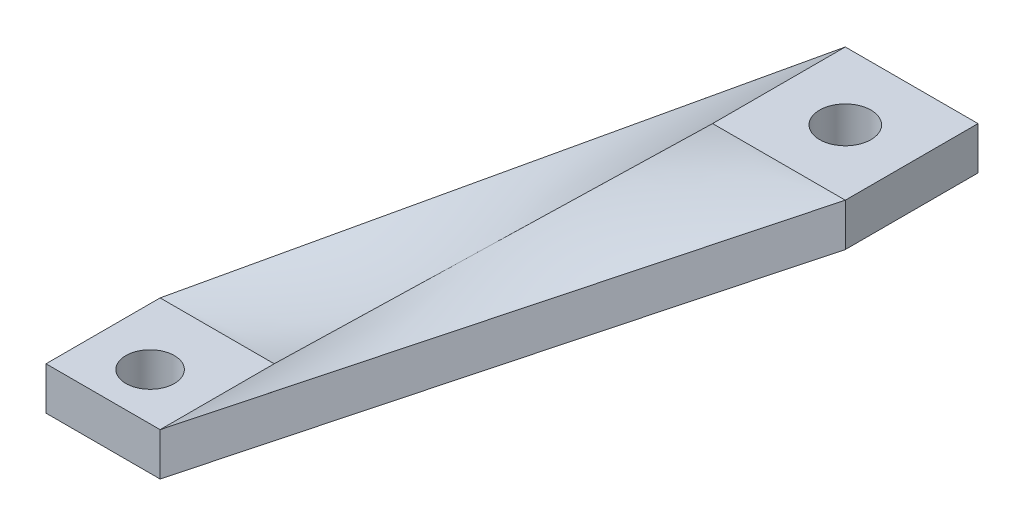
ISO-10303-21;
HEADER;
FILE_DESCRIPTION(('STEP AP214'),'2;1');
FILE_NAME('part.step','',(''),(''),'','','');
FILE_SCHEMA(('AUTOMOTIVE_DESIGN { 1 0 10303 214 1 1 1 1 }'));
ENDSEC;
DATA;
#1=APPLICATION_CONTEXT('core data for automotive mechanical design processes');
#2=APPLICATION_PROTOCOL_DEFINITION('international standard','automotive_design',2000,#1);
#3=PRODUCT_CONTEXT('',#1,'mechanical');
#4=PRODUCT('Part','Part','',(#3));
#5=PRODUCT_RELATED_PRODUCT_CATEGORY('part','',(#4));
#6=PRODUCT_DEFINITION_FORMATION('','',#4);
#7=PRODUCT_DEFINITION_CONTEXT('part definition',#1,'design');
#8=PRODUCT_DEFINITION('design','',#6,#7);
#9=PRODUCT_DEFINITION_SHAPE('','',#8);
#10=(LENGTH_UNIT() NAMED_UNIT(*) SI_UNIT(.MILLI.,.METRE.));
#11=(NAMED_UNIT(*) PLANE_ANGLE_UNIT() SI_UNIT($,.RADIAN.));
#12=(NAMED_UNIT(*) SI_UNIT($,.STERADIAN.) SOLID_ANGLE_UNIT());
#13=UNCERTAINTY_MEASURE_WITH_UNIT(LENGTH_MEASURE(1.E-05),#10,'distance_accuracy_value','');
#14=(GEOMETRIC_REPRESENTATION_CONTEXT(3) GLOBAL_UNCERTAINTY_ASSIGNED_CONTEXT((#13)) GLOBAL_UNIT_ASSIGNED_CONTEXT((#10,
#11,#12)) REPRESENTATION_CONTEXT('',''));
#15=CARTESIAN_POINT('',(0.,0.,0.));
#16=DIRECTION('',(0.,0.,1.));
#17=DIRECTION('',(1.,0.,0.));
#18=AXIS2_PLACEMENT_3D('',#15,#16,#17);
#19=CARTESIAN_POINT('',(0.,8.7442453895232,86.0034095229777));
#20=DIRECTION('',(0.,0.,1.));
#21=DIRECTION('',(0.,1.,0.));
#22=AXIS2_PLACEMENT_3D('',#19,#20,#21);
#23=PLANE('',#22);
#24=DIRECTION('',(1.,0.,0.));
#25=VECTOR('',#24,1.);
#26=CARTESIAN_POINT('',(0.,5.7442453895232,86.0034095229777));
#27=LINE('',#26,#25);
#28=CARTESIAN_POINT('',(199.460010772794,5.7442453895231,86.0034095229777));
#29=VERTEX_POINT('',#28);
#30=CARTESIAN_POINT('',(207.460010772794,5.7442453895231,86.0034095229777));
#31=VERTEX_POINT('',#30);
#32=EDGE_CURVE('E228',#29,#31,#27,.T.);
#33=ORIENTED_EDGE('',*,*,#32,.T.);
#34=DIRECTION('',(0.,-1.,0.));
#35=VECTOR('',#34,1.);
#36=CARTESIAN_POINT('',(207.460010772794,8.7442453895231,86.0034095229777));
#37=LINE('',#36,#35);
#38=CARTESIAN_POINT('',(207.460010772794,8.7442453895231,86.0034095229777));
#39=VERTEX_POINT('',#38);
#40=EDGE_CURVE('E250',#39,#31,#37,.T.);
#41=ORIENTED_EDGE('',*,*,#40,.F.);
#42=DIRECTION('',(1.,0.,0.));
#43=VECTOR('',#42,1.);
#44=CARTESIAN_POINT('',(0.,8.7442453895232,86.0034095229777));
#45=LINE('',#44,#43);
#46=CARTESIAN_POINT('',(199.460010772794,8.74424538952311,86.0034095229777));
#47=VERTEX_POINT('',#46);
#48=EDGE_CURVE('E240',#47,#39,#45,.T.);
#49=ORIENTED_EDGE('',*,*,#48,.F.);
#50=DIRECTION('',(0.,-1.,0.));
#51=VECTOR('',#50,1.);
#52=CARTESIAN_POINT('',(199.460010772794,8.74424538952311,86.0034095229777));
#53=LINE('',#52,#51);
#54=EDGE_CURVE('E12',#47,#29,#53,.T.);
#55=ORIENTED_EDGE('',*,*,#54,.T.);
#56=EDGE_LOOP('',(#33,#41,#49,#55));
#57=FACE_BOUND('',#56,.T.);
#58=ADVANCED_FACE('F157',(#57),#23,.T.);
#59=CARTESIAN_POINT('',(199.460010497585,8.74424538952311,-6.38269011452453E-07));
#60=DIRECTION('',(1.,0.,-3.19998484878669E-09));
#61=DIRECTION('',(3.19998484878669E-09,0.,1.));
#62=AXIS2_PLACEMENT_3D('',#59,#60,#61);
#63=PLANE('',#62);
#64=DIRECTION('',(-3.19998484878669E-09,0.,-1.));
#65=VECTOR('',#64,1.);
#66=CARTESIAN_POINT('',(199.460010497585,5.7442453895231,-6.38269011531105E-07));
#67=LINE('',#66,#65);
#68=CARTESIAN_POINT('',(199.460010747194,5.7442453895231,78.0034095229777));
#69=VERTEX_POINT('',#68);
#70=EDGE_CURVE('E257',#29,#69,#67,.T.);
#71=ORIENTED_EDGE('',*,*,#70,.F.);
#72=ORIENTED_EDGE('',*,*,#54,.F.);
#73=DIRECTION('',(-3.19998484878669E-09,0.,-1.));
#74=VECTOR('',#73,1.);
#75=CARTESIAN_POINT('',(199.460010497585,8.74424538952311,-6.38269011452453E-07));
#76=LINE('',#75,#74);
#77=CARTESIAN_POINT('',(199.460010747194,8.74424538952311,78.0034095229777));
#78=VERTEX_POINT('',#77);
#79=EDGE_CURVE('E235',#47,#78,#76,.T.);
#80=ORIENTED_EDGE('',*,*,#79,.T.);
#81=DIRECTION('',(0.,-1.,0.));
#82=VECTOR('',#81,1.);
#83=CARTESIAN_POINT('',(199.460010747194,8.74424538952311,78.0034095229777));
#84=LINE('',#83,#82);
#85=EDGE_CURVE('E166',#78,#69,#84,.T.);
#86=ORIENTED_EDGE('',*,*,#85,.T.);
#87=EDGE_LOOP('',(#71,#72,#80,#86));
#88=FACE_BOUND('',#87,.T.);
#89=ADVANCED_FACE('F282',(#88),#63,.F.);
#90=CARTESIAN_POINT('',(203.460010747194,8.7442453895231,82.7034095101777));
#91=DIRECTION('',(0.,-1.,0.));
#92=DIRECTION('',(1.,0.,0.));
#93=AXIS2_PLACEMENT_3D('',#90,#91,#92);
#94=CYLINDRICAL_SURFACE('',#93,1.69999999999999);
#95=CARTESIAN_POINT('',(203.460010747194,8.7442453895231,82.7034095101777));
#96=DIRECTION('',(0.,-1.,0.));
#97=DIRECTION('',(-1.,0.,0.));
#98=AXIS2_PLACEMENT_3D('',#95,#96,#97);
#99=CIRCLE('',#98,1.69999999999999);
#100=CARTESIAN_POINT('',(201.760010747194,8.7442453895231,82.7034095101777));
#101=VERTEX_POINT('',#100);
#102=EDGE_CURVE('E243',#101,#101,#99,.F.);
#103=ORIENTED_EDGE('',*,*,#102,.T.);
#104=EDGE_LOOP('',(#103));
#105=FACE_BOUND('',#104,.T.);
#106=CARTESIAN_POINT('',(203.460010747194,5.7442453895231,82.7034095101777));
#107=DIRECTION('',(0.,-1.,0.));
#108=DIRECTION('',(-1.,0.,0.));
#109=AXIS2_PLACEMENT_3D('',#106,#107,#108);
#110=CIRCLE('',#109,1.69999999999999);
#111=CARTESIAN_POINT('',(201.760010747194,5.7442453895231,82.7034095101777));
#112=VERTEX_POINT('',#111);
#113=EDGE_CURVE('E269',#112,#112,#110,.F.);
#114=ORIENTED_EDGE('',*,*,#113,.F.);
#115=EDGE_LOOP('',(#114));
#116=FACE_BOUND('',#115,.T.);
#117=ADVANCED_FACE('F399',(#105,#116),#94,.F.);
#118=CARTESIAN_POINT('',(0.,8.7442453895232,0.));
#119=DIRECTION('',(0.,1.,0.));
#120=DIRECTION('',(-1.,0.,0.));
#121=AXIS2_PLACEMENT_3D('',#118,#119,#120);
#122=PLANE('',#121);
#123=ORIENTED_EDGE('',*,*,#48,.T.);
#124=DIRECTION('',(3.19998484878669E-09,0.,1.));
#125=VECTOR('',#124,1.);
#126=CARTESIAN_POINT('',(207.460010497585,8.7442453895231,-6.63868890242747E-07));
#127=LINE('',#126,#125);
#128=CARTESIAN_POINT('',(207.460010747194,8.7442453895231,78.0034094973778));
#129=VERTEX_POINT('',#128);
#130=EDGE_CURVE('E222',#129,#39,#127,.T.);
#131=ORIENTED_EDGE('',*,*,#130,.F.);
#132=DIRECTION('',(1.,0.,-3.19998393061293E-09));
#133=VECTOR('',#132,1.);
#134=CARTESIAN_POINT('',(2.49609663369746E-07,8.7442453895232,78.0034101612465));
#135=LINE('',#134,#133);
#136=EDGE_CURVE('E230',#78,#129,#135,.T.);
#137=ORIENTED_EDGE('',*,*,#136,.F.);
#138=ORIENTED_EDGE('',*,*,#79,.F.);
#139=EDGE_LOOP('',(#123,#131,#137,#138));
#140=FACE_BOUND('',#139,.T.);
#141=ORIENTED_EDGE('',*,*,#102,.F.);
#142=EDGE_LOOP('',(#141));
#143=FACE_BOUND('',#142,.T.);
#144=ADVANCED_FACE('F237',(#140,#143),#122,.T.);
#145=CARTESIAN_POINT('',(0.,5.7442453895232,0.));
#146=DIRECTION('',(0.,1.,0.));
#147=DIRECTION('',(-1.,0.,0.));
#148=AXIS2_PLACEMENT_3D('',#145,#146,#147);
#149=PLANE('',#148);
#150=ORIENTED_EDGE('',*,*,#32,.F.);
#151=ORIENTED_EDGE('',*,*,#70,.T.);
#152=DIRECTION('',(1.,0.,-3.19998393061293E-09));
#153=VECTOR('',#152,1.);
#154=CARTESIAN_POINT('',(2.49609661863139E-07,5.7442453895232,78.0034101612465));
#155=LINE('',#154,#153);
#156=CARTESIAN_POINT('',(207.460010747194,5.7442453895231,78.0034094973778));
#157=VERTEX_POINT('',#156);
#158=EDGE_CURVE('E261',#69,#157,#155,.T.);
#159=ORIENTED_EDGE('',*,*,#158,.T.);
#160=DIRECTION('',(3.19998484878669E-09,0.,1.));
#161=VECTOR('',#160,1.);
#162=CARTESIAN_POINT('',(207.460010497585,5.7442453895231,-6.63868890321399E-07));
#163=LINE('',#162,#161);
#164=EDGE_CURVE('E265',#157,#31,#163,.T.);
#165=ORIENTED_EDGE('',*,*,#164,.T.);
#166=EDGE_LOOP('',(#150,#151,#159,#165));
#167=FACE_BOUND('',#166,.T.);
#168=ORIENTED_EDGE('',*,*,#113,.T.);
#169=EDGE_LOOP('',(#168));
#170=FACE_BOUND('',#169,.T.);
#171=ADVANCED_FACE('F287',(#167,#170),#149,.F.);
#172=CARTESIAN_POINT('',(207.460010747194,8.7442453895231,78.0034094973778));
#173=CARTESIAN_POINT('',(232.000000065795,32.4999999999999,71.8034094188298));
#174=CARTESIAN_POINT('',(199.460010747194,8.74424538952311,78.0034095229777));
#175=CARTESIAN_POINT('',(232.000000036021,32.5,62.4989992095847));
#176=B_SPLINE_SURFACE_WITH_KNOTS('',1,1,((#172,#173),(#174,#175)),.UNSPECIFIED.,.F.,.F.,.F.,(2,
2),(2,2),(0.,1.),(0.,1.),.UNSPECIFIED.);
#177=DIRECTION('',(0.706941043969942,0.684349033187841,-0.178607841724701));
#178=VECTOR('',#177,1.);
#179=CARTESIAN_POINT('',(219.730005406495,20.6221226947615,74.9034094581038));
#180=LINE('',#179,#178);
#181=CARTESIAN_POINT('',(232.000000065795,32.4999999999999,71.8034094188298));
#182=VERTEX_POINT('',#181);
#183=EDGE_CURVE('E219',#129,#182,#180,.T.);
#184=DIRECTION('',(-3.19998370716861E-09,0.,-1.));
#185=VECTOR('',#184,1.);
#186=CARTESIAN_POINT('',(232.000000050908,32.4999999999999,67.1512043142073));
#187=LINE('',#186,#185);
#188=CARTESIAN_POINT('',(232.000000036021,32.5,62.4989992095847));
#189=VERTEX_POINT('',#188);
#190=EDGE_CURVE('E307',#182,#189,#187,.T.);
#191=DIRECTION('',(0.753779184548307,0.550294997938539,-0.359155058694032));
#192=VECTOR('',#191,1.);
#193=CARTESIAN_POINT('',(215.730005391608,20.6221226947615,70.2512043662812));
#194=LINE('',#193,#192);
#195=EDGE_CURVE('E173',#78,#189,#194,.T.);
#196=ORIENTED_EDGE('',*,*,#136,.T.);
#197=ORIENTED_EDGE('',*,*,#183,.T.);
#198=ORIENTED_EDGE('',*,*,#190,.T.);
#199=ORIENTED_EDGE('',*,*,#195,.F.);
#200=EDGE_LOOP('',(#196,#197,#198,#199));
#201=FACE_BOUND('',#200,.T.);
#202=ADVANCED_FACE('F231',(#201),#176,.F.);
#203=CARTESIAN_POINT('',(199.460010747194,8.74424538952311,78.0034095229777));
#204=DIRECTION('',(-0.430141114303507,0.,-0.902761663887948));
#205=DIRECTION('',(0.,-1.,0.));
#206=AXIS2_PLACEMENT_3D('',#203,#204,#205);
#207=PLANE('',#206);
#208=ORIENTED_EDGE('',*,*,#85,.F.);
#209=ORIENTED_EDGE('',*,*,#195,.T.);
#210=DIRECTION('',(0.,-1.,0.));
#211=VECTOR('',#210,1.);
#212=CARTESIAN_POINT('',(232.000000036021,31.,62.4989992095847));
#213=LINE('',#212,#211);
#214=CARTESIAN_POINT('',(232.000000036021,29.5,62.4989992095847));
#215=VERTEX_POINT('',#214);
#216=EDGE_CURVE('E302',#189,#215,#213,.T.);
#217=ORIENTED_EDGE('',*,*,#216,.T.);
#218=DIRECTION('',(0.753779184548307,0.550294997938539,-0.359155058694032));
#219=VECTOR('',#218,1.);
#220=CARTESIAN_POINT('',(215.730005391608,17.6221226947615,70.2512043662812));
#221=LINE('',#220,#219);
#222=EDGE_CURVE('E314',#69,#215,#221,.T.);
#223=ORIENTED_EDGE('',*,*,#222,.F.);
#224=EDGE_LOOP('',(#208,#209,#217,#223));
#225=FACE_BOUND('',#224,.T.);
#226=ADVANCED_FACE('F373',(#225),#207,.T.);
#227=CARTESIAN_POINT('',(199.460010747194,5.7442453895231,78.0034095229777));
#228=CARTESIAN_POINT('',(232.000000036021,29.5,62.4989992095847));
#229=CARTESIAN_POINT('',(207.460010747194,5.7442453895231,78.0034094973778));
#230=CARTESIAN_POINT('',(232.000000065795,29.4999999999999,71.8034094188298));
#231=B_SPLINE_SURFACE_WITH_KNOTS('',1,1,((#227,#228),(#229,#230)),.UNSPECIFIED.,.F.,.F.,.F.,(2,
2),(2,2),(0.,1.),(0.,1.),.UNSPECIFIED.);
#232=DIRECTION('',(3.19998370716861E-09,0.,1.));
#233=VECTOR('',#232,1.);
#234=CARTESIAN_POINT('',(232.000000050908,29.5,67.1512043142073));
#235=LINE('',#234,#233);
#236=CARTESIAN_POINT('',(232.000000065795,29.4999999999999,71.8034094188298));
#237=VERTEX_POINT('',#236);
#238=EDGE_CURVE('E298',#215,#237,#235,.T.);
#239=DIRECTION('',(0.706941043969942,0.684349033187841,-0.178607841724701));
#240=VECTOR('',#239,1.);
#241=CARTESIAN_POINT('',(219.730005406495,17.6221226947615,74.9034094581038));
#242=LINE('',#241,#240);
#243=EDGE_CURVE('E310',#157,#237,#242,.T.);
#244=ORIENTED_EDGE('',*,*,#158,.F.);
#245=ORIENTED_EDGE('',*,*,#222,.T.);
#246=ORIENTED_EDGE('',*,*,#238,.T.);
#247=ORIENTED_EDGE('',*,*,#243,.F.);
#248=EDGE_LOOP('',(#244,#245,#246,#247));
#249=FACE_BOUND('',#248,.T.);
#250=ADVANCED_FACE('F371',(#249),#231,.F.);
#251=CARTESIAN_POINT('',(0.,29.5,0.));
#252=DIRECTION('',(0.,1.,0.));
#253=DIRECTION('',(0.,0.,-1.));
#254=AXIS2_PLACEMENT_3D('',#251,#252,#253);
#255=PLANE('',#254);
#256=DIRECTION('',(1.,0.,-3.62486036977128E-09));
#257=VECTOR('',#256,1.);
#258=CARTESIAN_POINT('',(241.304410241313,29.4999999999999,71.8034093851026));
#259=LINE('',#258,#257);
#260=CARTESIAN_POINT('',(241.304410241313,29.4999999999999,71.8034093851026));
#261=VERTEX_POINT('',#260);
#262=EDGE_CURVE('E329',#237,#261,#259,.T.);
#263=ORIENTED_EDGE('',*,*,#262,.F.);
#264=ORIENTED_EDGE('',*,*,#238,.F.);
#265=DIRECTION('',(-1.,0.,0.));
#266=VECTOR('',#265,1.);
#267=CARTESIAN_POINT('',(232.000000036021,29.5,62.4989992095847));
#268=LINE('',#267,#266);
#269=CARTESIAN_POINT('',(241.304410241313,29.4999999999999,62.4989992095847));
#270=VERTEX_POINT('',#269);
#271=EDGE_CURVE('E325',#270,#215,#268,.T.);
#272=ORIENTED_EDGE('',*,*,#271,.F.);
#273=DIRECTION('',(0.,0.,-1.));
#274=VECTOR('',#273,1.);
#275=CARTESIAN_POINT('',(241.304410241313,29.4999999999999,62.4989992095847));
#276=LINE('',#275,#274);
#277=EDGE_CURVE('E338',#261,#270,#276,.T.);
#278=ORIENTED_EDGE('',*,*,#277,.F.);
#279=EDGE_LOOP('',(#263,#264,#272,#278));
#280=FACE_BOUND('',#279,.T.);
#281=CARTESIAN_POINT('',(236.730100011833,29.4999999999999,67.229099155144));
#282=DIRECTION('',(0.,1.,0.));
#283=DIRECTION('',(0.,0.,1.));
#284=AXIS2_PLACEMENT_3D('',#281,#282,#283);
#285=CIRCLE('',#284,1.80000000000001);
#286=CARTESIAN_POINT('',(236.730100011833,29.4999999999999,69.029099155144));
#287=VERTEX_POINT('',#286);
#288=EDGE_CURVE('E336',#287,#287,#285,.T.);
#289=ORIENTED_EDGE('',*,*,#288,.T.);
#290=EDGE_LOOP('',(#289));
#291=FACE_BOUND('',#290,.T.);
#292=ADVANCED_FACE('F366',(#280,#291),#255,.F.);
#293=CARTESIAN_POINT('',(0.,32.5,0.));
#294=DIRECTION('',(0.,1.,0.));
#295=DIRECTION('',(0.,0.,-1.));
#296=AXIS2_PLACEMENT_3D('',#293,#294,#295);
#297=PLANE('',#296);
#298=DIRECTION('',(1.,0.,-3.62486036977128E-09));
#299=VECTOR('',#298,1.);
#300=CARTESIAN_POINT('',(241.304410241313,32.4999999999999,71.8034093851026));
#301=LINE('',#300,#299);
#302=CARTESIAN_POINT('',(241.304410241313,32.4999999999999,71.8034093851026));
#303=VERTEX_POINT('',#302);
#304=EDGE_CURVE('E225',#182,#303,#301,.T.);
#305=ORIENTED_EDGE('',*,*,#304,.T.);
#306=DIRECTION('',(0.,0.,-1.));
#307=VECTOR('',#306,1.);
#308=CARTESIAN_POINT('',(241.304410241313,32.4999999999999,62.4989992095847));
#309=LINE('',#308,#307);
#310=CARTESIAN_POINT('',(241.304410241313,32.4999999999999,62.4989992095847));
#311=VERTEX_POINT('',#310);
#312=EDGE_CURVE('E330',#303,#311,#309,.T.);
#313=ORIENTED_EDGE('',*,*,#312,.T.);
#314=DIRECTION('',(-1.,0.,0.));
#315=VECTOR('',#314,1.);
#316=CARTESIAN_POINT('',(232.000000036021,32.5,62.4989992095847));
#317=LINE('',#316,#315);
#318=EDGE_CURVE('E326',#311,#189,#317,.T.);
#319=ORIENTED_EDGE('',*,*,#318,.T.);
#320=ORIENTED_EDGE('',*,*,#190,.F.);
#321=EDGE_LOOP('',(#305,#313,#319,#320));
#322=FACE_BOUND('',#321,.T.);
#323=CARTESIAN_POINT('',(236.730100011833,32.4999999999999,67.229099155144));
#324=DIRECTION('',(0.,1.,0.));
#325=DIRECTION('',(0.,0.,1.));
#326=AXIS2_PLACEMENT_3D('',#323,#324,#325);
#327=CIRCLE('',#326,1.80000000000001);
#328=CARTESIAN_POINT('',(236.730100011833,32.4999999999999,69.029099155144));
#329=VERTEX_POINT('',#328);
#330=EDGE_CURVE('E345',#329,#329,#327,.T.);
#331=ORIENTED_EDGE('',*,*,#330,.F.);
#332=EDGE_LOOP('',(#331));
#333=FACE_BOUND('',#332,.T.);
#334=ADVANCED_FACE('F378',(#322,#333),#297,.T.);
#335=CARTESIAN_POINT('',(241.304410241313,29.4999999999999,62.4989992095847));
#336=DIRECTION('',(-1.,0.,0.));
#337=DIRECTION('',(0.,-1.,0.));
#338=AXIS2_PLACEMENT_3D('',#335,#336,#337);
#339=PLANE('',#338);
#340=ORIENTED_EDGE('',*,*,#312,.F.);
#341=DIRECTION('',(0.,1.,0.));
#342=VECTOR('',#341,1.);
#343=CARTESIAN_POINT('',(241.304410241313,29.4999999999999,71.8034093851026));
#344=LINE('',#343,#342);
#345=EDGE_CURVE('E303',#261,#303,#344,.T.);
#346=ORIENTED_EDGE('',*,*,#345,.F.);
#347=ORIENTED_EDGE('',*,*,#277,.T.);
#348=DIRECTION('',(0.,1.,0.));
#349=VECTOR('',#348,1.);
#350=CARTESIAN_POINT('',(241.304410241313,29.4999999999999,62.4989992095847));
#351=LINE('',#350,#349);
#352=EDGE_CURVE('E323',#270,#311,#351,.T.);
#353=ORIENTED_EDGE('',*,*,#352,.T.);
#354=EDGE_LOOP('',(#340,#346,#347,#353));
#355=FACE_BOUND('',#354,.T.);
#356=ADVANCED_FACE('F363',(#355),#339,.F.);
#357=CARTESIAN_POINT('',(232.000000036021,29.5,62.4989992095847));
#358=DIRECTION('',(0.,0.,1.));
#359=DIRECTION('',(-1.,0.,0.));
#360=AXIS2_PLACEMENT_3D('',#357,#358,#359);
#361=PLANE('',#360);
#362=ORIENTED_EDGE('',*,*,#318,.F.);
#363=ORIENTED_EDGE('',*,*,#352,.F.);
#364=ORIENTED_EDGE('',*,*,#271,.T.);
#365=ORIENTED_EDGE('',*,*,#216,.F.);
#366=EDGE_LOOP('',(#362,#363,#364,#365));
#367=FACE_BOUND('',#366,.T.);
#368=ADVANCED_FACE('F376',(#367),#361,.F.);
#369=CARTESIAN_POINT('',(236.730100011833,29.4999999999999,67.229099155144));
#370=DIRECTION('',(0.,1.,0.));
#371=DIRECTION('',(0.,0.,-1.));
#372=AXIS2_PLACEMENT_3D('',#369,#370,#371);
#373=CYLINDRICAL_SURFACE('',#372,1.80000000000001);
#374=ORIENTED_EDGE('',*,*,#288,.F.);
#375=EDGE_LOOP('',(#374));
#376=FACE_BOUND('',#375,.T.);
#377=ORIENTED_EDGE('',*,*,#330,.T.);
#378=EDGE_LOOP('',(#377));
#379=FACE_BOUND('',#378,.T.);
#380=ADVANCED_FACE('F384',(#376,#379),#373,.F.);
#381=CARTESIAN_POINT('',(207.460010747194,5.7442453895231,78.0034094973778));
#382=CARTESIAN_POINT('',(232.000000065795,29.4999999999999,71.8034094188298));
#383=CARTESIAN_POINT('',(207.460010772794,5.7442453895231,86.0034095229777));
#384=CARTESIAN_POINT('',(241.304410241313,29.4999999999999,71.8034093851026));
#385=B_SPLINE_SURFACE_WITH_KNOTS('',1,1,((#381,#382),(#383,#384)),.UNSPECIFIED.,.F.,.F.,.F.,(2,
2),(2,2),(0.,1.),(0.,1.),.UNSPECIFIED.);
#386=DIRECTION('',(0.774120973246164,0.543363988371702,-0.324795774173879));
#387=VECTOR('',#386,1.);
#388=CARTESIAN_POINT('',(224.382210507053,17.6221226947615,78.9034094540401));
#389=LINE('',#388,#387);
#390=EDGE_CURVE('E349',#31,#261,#389,.T.);
#391=ORIENTED_EDGE('',*,*,#164,.F.);
#392=ORIENTED_EDGE('',*,*,#243,.T.);
#393=ORIENTED_EDGE('',*,*,#262,.T.);
#394=ORIENTED_EDGE('',*,*,#390,.F.);
#395=EDGE_LOOP('',(#391,#392,#393,#394));
#396=FACE_BOUND('',#395,.T.);
#397=ADVANCED_FACE('F369',(#396),#385,.F.);
#398=CARTESIAN_POINT('',(207.460010772794,5.7442453895231,86.0034095229777));
#399=DIRECTION('',(0.386893211645619,0.,0.922124526722144));
#400=DIRECTION('',(0.,1.,0.));
#401=AXIS2_PLACEMENT_3D('',#398,#399,#400);
#402=PLANE('',#401);
#403=ORIENTED_EDGE('',*,*,#40,.T.);
#404=ORIENTED_EDGE('',*,*,#390,.T.);
#405=ORIENTED_EDGE('',*,*,#345,.T.);
#406=DIRECTION('',(0.774120973246164,0.543363988371702,-0.324795774173879));
#407=VECTOR('',#406,1.);
#408=CARTESIAN_POINT('',(224.382210507053,20.6221226947615,78.9034094540401));
#409=LINE('',#408,#407);
#410=EDGE_CURVE('E352',#39,#303,#409,.T.);
#411=ORIENTED_EDGE('',*,*,#410,.F.);
#412=EDGE_LOOP('',(#403,#404,#405,#411));
#413=FACE_BOUND('',#412,.T.);
#414=ADVANCED_FACE('F358',(#413),#402,.T.);
#415=CARTESIAN_POINT('',(207.460010772794,8.7442453895231,86.0034095229777));
#416=CARTESIAN_POINT('',(241.304410241313,32.4999999999999,71.8034093851026));
#417=CARTESIAN_POINT('',(207.460010747194,8.7442453895231,78.0034094973778));
#418=CARTESIAN_POINT('',(232.000000065795,32.4999999999999,71.8034094188298));
#419=B_SPLINE_SURFACE_WITH_KNOTS('',1,1,((#415,#416),(#417,#418)),.UNSPECIFIED.,.F.,.F.,.F.,(2,
2),(2,2),(0.,1.),(0.,1.),.UNSPECIFIED.);
#420=ORIENTED_EDGE('',*,*,#130,.T.);
#421=ORIENTED_EDGE('',*,*,#410,.T.);
#422=ORIENTED_EDGE('',*,*,#304,.F.);
#423=ORIENTED_EDGE('',*,*,#183,.F.);
#424=EDGE_LOOP('',(#420,#421,#422,#423));
#425=FACE_BOUND('',#424,.T.);
#426=ADVANCED_FACE('F220',(#425),#419,.F.);
#427=CLOSED_SHELL('',(#58,#89,#117,#144,#171,#202,#226,#250,#292,#334,#356,#368,#380,#397,#414,#426));
#428=MANIFOLD_SOLID_BREP('B2',#427);
#429=ADVANCED_BREP_SHAPE_REPRESENTATION('',(#18,#428),#14);
#430=SHAPE_DEFINITION_REPRESENTATION(#9,#429);
ENDSEC;
END-ISO-10303-21;
